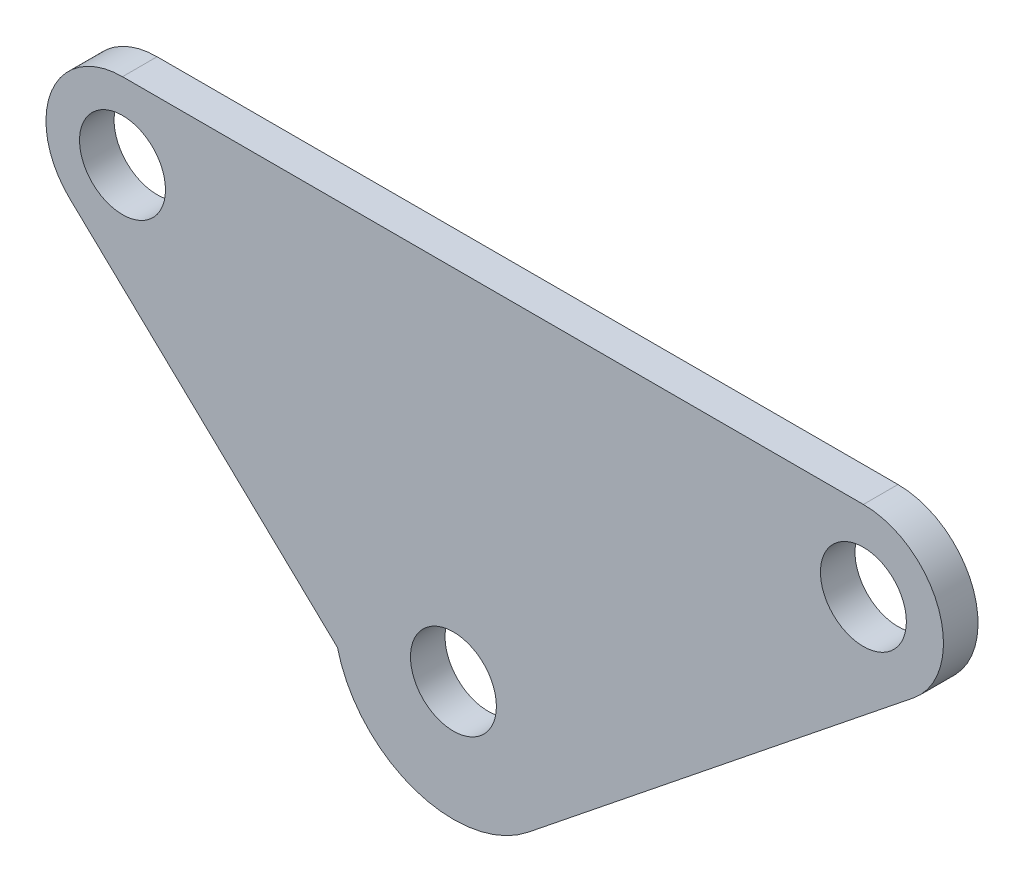
ISO-10303-21;
HEADER;
FILE_DESCRIPTION(('STEP AP214'),'2;1');
FILE_NAME('part.step','',(''),(''),'','','');
FILE_SCHEMA(('AUTOMOTIVE_DESIGN { 1 0 10303 214 1 1 1 1 }'));
ENDSEC;
DATA;
#1=APPLICATION_CONTEXT('core data for automotive mechanical design processes');
#2=APPLICATION_PROTOCOL_DEFINITION('international standard','automotive_design',2000,#1);
#3=PRODUCT_CONTEXT('',#1,'mechanical');
#4=PRODUCT('Part','Part','',(#3));
#5=PRODUCT_RELATED_PRODUCT_CATEGORY('part','',(#4));
#6=PRODUCT_DEFINITION_FORMATION('','',#4);
#7=PRODUCT_DEFINITION_CONTEXT('part definition',#1,'design');
#8=PRODUCT_DEFINITION('design','',#6,#7);
#9=PRODUCT_DEFINITION_SHAPE('','',#8);
#10=(LENGTH_UNIT() NAMED_UNIT(*) SI_UNIT(.MILLI.,.METRE.));
#11=(NAMED_UNIT(*) PLANE_ANGLE_UNIT() SI_UNIT($,.RADIAN.));
#12=(NAMED_UNIT(*) SI_UNIT($,.STERADIAN.) SOLID_ANGLE_UNIT());
#13=UNCERTAINTY_MEASURE_WITH_UNIT(LENGTH_MEASURE(1.E-05),#10,'distance_accuracy_value','');
#14=(GEOMETRIC_REPRESENTATION_CONTEXT(3) GLOBAL_UNCERTAINTY_ASSIGNED_CONTEXT((#13)) GLOBAL_UNIT_ASSIGNED_CONTEXT((#10,
#11,#12)) REPRESENTATION_CONTEXT('',''));
#15=CARTESIAN_POINT('',(0.,0.,0.));
#16=DIRECTION('',(0.,0.,1.));
#17=DIRECTION('',(1.,0.,0.));
#18=AXIS2_PLACEMENT_3D('',#15,#16,#17);
#19=CARTESIAN_POINT('',(-25.1557154604881,24.9764348991561,0.));
#20=DIRECTION('',(0.,0.,-1.));
#21=DIRECTION('',(-1.,0.,0.));
#22=AXIS2_PLACEMENT_3D('',#19,#20,#21);
#23=PLANE('',#22);
#24=CARTESIAN_POINT('',(-25.155715460488,24.9764348991561,0.));
#25=DIRECTION('',(0.,0.,1.));
#26=DIRECTION('',(1.,0.,0.));
#27=AXIS2_PLACEMENT_3D('',#24,#25,#26);
#28=CIRCLE('',#27,4.35);
#29=CARTESIAN_POINT('',(-20.805715460488,24.9764348991561,0.));
#30=VERTEX_POINT('',#29);
#31=EDGE_CURVE('E224',#30,#30,#28,.T.);
#32=ORIENTED_EDGE('',*,*,#31,.F.);
#33=EDGE_LOOP('',(#32));
#34=FACE_BOUND('',#33,.T.);
#35=CARTESIAN_POINT('',(8.34368763549736,-3.55294561262175,0.));
#36=DIRECTION('',(0.,0.,1.));
#37=DIRECTION('',(1.,0.,0.));
#38=AXIS2_PLACEMENT_3D('',#35,#36,#37);
#39=CIRCLE('',#38,4.35);
#40=CARTESIAN_POINT('',(12.6936876354974,-3.55294561262175,0.));
#41=VERTEX_POINT('',#40);
#42=EDGE_CURVE('E228',#41,#41,#39,.T.);
#43=ORIENTED_EDGE('',*,*,#42,.F.);
#44=EDGE_LOOP('',(#43));
#45=FACE_BOUND('',#44,.T.);
#46=CARTESIAN_POINT('',(49.8442845395119,24.6173180206352,0.));
#47=DIRECTION('',(0.,0.,1.));
#48=DIRECTION('',(1.,0.,0.));
#49=AXIS2_PLACEMENT_3D('',#46,#47,#48);
#50=CIRCLE('',#49,4.35);
#51=CARTESIAN_POINT('',(54.1942845395119,24.6173180206352,0.));
#52=VERTEX_POINT('',#51);
#53=EDGE_CURVE('E154',#52,#52,#50,.T.);
#54=ORIENTED_EDGE('',*,*,#53,.F.);
#55=EDGE_LOOP('',(#54));
#56=FACE_BOUND('',#55,.T.);
#57=DIRECTION('',(0.78018197470434,0.625552624761848,0.));
#58=VECTOR('',#57,1.);
#59=CARTESIAN_POINT('',(12.5611499458894,-15.6661204532109,0.));
#60=LINE('',#59,#58);
#61=CARTESIAN_POINT('',(15.9058214676602,-12.9843511772637,0.));
#62=VERTEX_POINT('',#61);
#63=CARTESIAN_POINT('',(54.9149202028772,18.2932800608287,0.));
#64=VERTEX_POINT('',#63);
#65=EDGE_CURVE('E99',#62,#64,#60,.T.);
#66=ORIENTED_EDGE('',*,*,#65,.T.);
#67=CARTESIAN_POINT('',(49.8442845395119,24.6173180206352,0.));
#68=DIRECTION('',(0.,0.,1.));
#69=DIRECTION('',(1.,0.,0.));
#70=AXIS2_PLACEMENT_3D('',#67,#68,#69);
#71=CIRCLE('',#70,8.10584987201626);
#72=CARTESIAN_POINT('',(49.8442845395119,32.7231678926515,0.));
#73=VERTEX_POINT('',#72);
#74=EDGE_CURVE('E147',#73,#64,#71,.F.);
#75=ORIENTED_EDGE('',*,*,#74,.F.);
#76=DIRECTION('',(-1.,0.,0.));
#77=VECTOR('',#76,1.);
#78=CARTESIAN_POINT('',(0.,32.7231678926515,0.));
#79=LINE('',#78,#77);
#80=CARTESIAN_POINT('',(-25.1557154604881,32.7231678926515,0.));
#81=VERTEX_POINT('',#80);
#82=EDGE_CURVE('E151',#73,#81,#79,.T.);
#83=ORIENTED_EDGE('',*,*,#82,.T.);
#84=CARTESIAN_POINT('',(-25.155715460488,24.9764348991561,0.));
#85=DIRECTION('',(0.,0.,1.));
#86=DIRECTION('',(1.,0.,0.));
#87=AXIS2_PLACEMENT_3D('',#84,#85,#86);
#88=CIRCLE('',#87,7.74673299349537);
#89=CARTESIAN_POINT('',(-30.497200323128,19.3656941695646,0.));
#90=VERTEX_POINT('',#89);
#91=EDGE_CURVE('E178',#90,#81,#88,.F.);
#92=ORIENTED_EDGE('',*,*,#91,.F.);
#93=DIRECTION('',(0.724271861996882,-0.689514517555337,0.));
#94=VECTOR('',#93,1.);
#95=CARTESIAN_POINT('',(-4.82814268268854,-5.0715217761848,0.));
#96=LINE('',#95,#94);
#97=CARTESIAN_POINT('',(-3.39661911085823,-6.43434744537243,0.));
#98=VERTEX_POINT('',#97);
#99=EDGE_CURVE('E174',#90,#98,#96,.T.);
#100=ORIENTED_EDGE('',*,*,#99,.T.);
#101=CARTESIAN_POINT('',(8.34368763549738,-3.55294561262168,0.));
#102=DIRECTION('',(0.,0.,1.));
#103=DIRECTION('',(1.,0.,0.));
#104=AXIS2_PLACEMENT_3D('',#101,#102,#103);
#105=CIRCLE('',#104,12.0887252851697);
#106=EDGE_CURVE('E170',#62,#98,#105,.F.);
#107=ORIENTED_EDGE('',*,*,#106,.F.);
#108=EDGE_LOOP('',(#66,#75,#83,#92,#100,#107));
#109=FACE_BOUND('',#108,.T.);
#110=ADVANCED_FACE('F75',(#34,#45,#56,#109),#23,.F.);
#111=CARTESIAN_POINT('',(12.5611499458894,-15.6661204532109,-3.5));
#112=DIRECTION('',(0.625552624761848,-0.78018197470434,0.));
#113=DIRECTION('',(0.78018197470434,0.625552624761848,0.));
#114=AXIS2_PLACEMENT_3D('',#111,#112,#113);
#115=PLANE('',#114);
#116=ORIENTED_EDGE('',*,*,#65,.F.);
#117=DIRECTION('',(0.,0.,1.));
#118=VECTOR('',#117,1.);
#119=CARTESIAN_POINT('',(15.9058214676602,-12.9843511772637,-3.5));
#120=LINE('',#119,#118);
#121=CARTESIAN_POINT('',(15.9058214676602,-12.9843511772637,-3.5));
#122=VERTEX_POINT('',#121);
#123=EDGE_CURVE('E78',#122,#62,#120,.T.);
#124=ORIENTED_EDGE('',*,*,#123,.F.);
#125=DIRECTION('',(0.78018197470434,0.625552624761848,0.));
#126=VECTOR('',#125,1.);
#127=CARTESIAN_POINT('',(12.5611499458894,-15.6661204532109,-3.5));
#128=LINE('',#127,#126);
#129=CARTESIAN_POINT('',(54.9149202028772,18.2932800608287,-3.5));
#130=VERTEX_POINT('',#129);
#131=EDGE_CURVE('E129',#122,#130,#128,.T.);
#132=ORIENTED_EDGE('',*,*,#131,.T.);
#133=DIRECTION('',(0.,0.,1.));
#134=VECTOR('',#133,1.);
#135=CARTESIAN_POINT('',(54.9149202028772,18.2932800608287,-3.5));
#136=LINE('',#135,#134);
#137=EDGE_CURVE('E12',#130,#64,#136,.T.);
#138=ORIENTED_EDGE('',*,*,#137,.T.);
#139=EDGE_LOOP('',(#116,#124,#132,#138));
#140=FACE_BOUND('',#139,.T.);
#141=ADVANCED_FACE('F127',(#140),#115,.T.);
#142=CARTESIAN_POINT('',(49.8442845395119,24.6173180206352,-3.5));
#143=DIRECTION('',(0.,0.,1.));
#144=DIRECTION('',(1.,0.,0.));
#145=AXIS2_PLACEMENT_3D('',#142,#143,#144);
#146=CYLINDRICAL_SURFACE('',#145,8.10584987201626);
#147=ORIENTED_EDGE('',*,*,#74,.T.);
#148=ORIENTED_EDGE('',*,*,#137,.F.);
#149=CARTESIAN_POINT('',(49.8442845395119,24.6173180206352,-3.5));
#150=DIRECTION('',(0.,0.,1.));
#151=DIRECTION('',(1.,0.,0.));
#152=AXIS2_PLACEMENT_3D('',#149,#150,#151);
#153=CIRCLE('',#152,8.10584987201626);
#154=CARTESIAN_POINT('',(49.8442845395119,32.7231678926515,-3.5));
#155=VERTEX_POINT('',#154);
#156=EDGE_CURVE('E133',#155,#130,#153,.F.);
#157=ORIENTED_EDGE('',*,*,#156,.F.);
#158=DIRECTION('',(0.,0.,1.));
#159=VECTOR('',#158,1.);
#160=CARTESIAN_POINT('',(49.8442845395119,32.7231678926515,-3.5));
#161=LINE('',#160,#159);
#162=EDGE_CURVE('E84',#155,#73,#161,.T.);
#163=ORIENTED_EDGE('',*,*,#162,.T.);
#164=EDGE_LOOP('',(#147,#148,#157,#163));
#165=FACE_BOUND('',#164,.T.);
#166=ADVANCED_FACE('F207',(#165),#146,.T.);
#167=CARTESIAN_POINT('',(0.,32.7231678926515,-3.5));
#168=DIRECTION('',(0.,1.,0.));
#169=DIRECTION('',(-1.,0.,0.));
#170=AXIS2_PLACEMENT_3D('',#167,#168,#169);
#171=PLANE('',#170);
#172=ORIENTED_EDGE('',*,*,#82,.F.);
#173=ORIENTED_EDGE('',*,*,#162,.F.);
#174=DIRECTION('',(-1.,0.,0.));
#175=VECTOR('',#174,1.);
#176=CARTESIAN_POINT('',(0.,32.7231678926515,-3.5));
#177=LINE('',#176,#175);
#178=CARTESIAN_POINT('',(-25.1557154604881,32.7231678926515,-3.5));
#179=VERTEX_POINT('',#178);
#180=EDGE_CURVE('E163',#155,#179,#177,.T.);
#181=ORIENTED_EDGE('',*,*,#180,.T.);
#182=DIRECTION('',(0.,0.,1.));
#183=VECTOR('',#182,1.);
#184=CARTESIAN_POINT('',(-25.1557154604881,32.7231678926515,-3.5));
#185=LINE('',#184,#183);
#186=EDGE_CURVE('E187',#179,#81,#185,.T.);
#187=ORIENTED_EDGE('',*,*,#186,.T.);
#188=EDGE_LOOP('',(#172,#173,#181,#187));
#189=FACE_BOUND('',#188,.T.);
#190=ADVANCED_FACE('F205',(#189),#171,.T.);
#191=CARTESIAN_POINT('',(-25.155715460488,24.9764348991561,-3.5));
#192=DIRECTION('',(0.,0.,1.));
#193=DIRECTION('',(1.,0.,0.));
#194=AXIS2_PLACEMENT_3D('',#191,#192,#193);
#195=CYLINDRICAL_SURFACE('',#194,7.74673299349537);
#196=ORIENTED_EDGE('',*,*,#91,.T.);
#197=ORIENTED_EDGE('',*,*,#186,.F.);
#198=CARTESIAN_POINT('',(-25.155715460488,24.9764348991561,-3.5));
#199=DIRECTION('',(0.,0.,1.));
#200=DIRECTION('',(1.,0.,0.));
#201=AXIS2_PLACEMENT_3D('',#198,#199,#200);
#202=CIRCLE('',#201,7.74673299349537);
#203=CARTESIAN_POINT('',(-30.497200323128,19.3656941695646,-3.5));
#204=VERTEX_POINT('',#203);
#205=EDGE_CURVE('E159',#204,#179,#202,.F.);
#206=ORIENTED_EDGE('',*,*,#205,.F.);
#207=DIRECTION('',(0.,0.,1.));
#208=VECTOR('',#207,1.);
#209=CARTESIAN_POINT('',(-30.497200323128,19.3656941695646,-3.5));
#210=LINE('',#209,#208);
#211=EDGE_CURVE('E190',#204,#90,#210,.T.);
#212=ORIENTED_EDGE('',*,*,#211,.T.);
#213=EDGE_LOOP('',(#196,#197,#206,#212));
#214=FACE_BOUND('',#213,.T.);
#215=ADVANCED_FACE('F202',(#214),#195,.T.);
#216=CARTESIAN_POINT('',(-4.82814268268854,-5.0715217761848,-3.5));
#217=DIRECTION('',(-0.689514517555337,-0.724271861996882,0.));
#218=DIRECTION('',(0.724271861996882,-0.689514517555337,0.));
#219=AXIS2_PLACEMENT_3D('',#216,#217,#218);
#220=PLANE('',#219);
#221=ORIENTED_EDGE('',*,*,#99,.F.);
#222=ORIENTED_EDGE('',*,*,#211,.F.);
#223=DIRECTION('',(0.724271861996882,-0.689514517555337,0.));
#224=VECTOR('',#223,1.);
#225=CARTESIAN_POINT('',(-4.82814268268854,-5.0715217761848,-3.5));
#226=LINE('',#225,#224);
#227=CARTESIAN_POINT('',(-3.39661911085823,-6.43434744537243,-3.5));
#228=VERTEX_POINT('',#227);
#229=EDGE_CURVE('E140',#204,#228,#226,.T.);
#230=ORIENTED_EDGE('',*,*,#229,.T.);
#231=DIRECTION('',(0.,0.,1.));
#232=VECTOR('',#231,1.);
#233=CARTESIAN_POINT('',(-3.39661911085823,-6.43434744537243,-3.5));
#234=LINE('',#233,#232);
#235=EDGE_CURVE('E92',#228,#98,#234,.T.);
#236=ORIENTED_EDGE('',*,*,#235,.T.);
#237=EDGE_LOOP('',(#221,#222,#230,#236));
#238=FACE_BOUND('',#237,.T.);
#239=ADVANCED_FACE('F195',(#238),#220,.T.);
#240=CARTESIAN_POINT('',(8.34368763549738,-3.55294561262168,-3.5));
#241=DIRECTION('',(0.,0.,1.));
#242=DIRECTION('',(1.,0.,0.));
#243=AXIS2_PLACEMENT_3D('',#240,#241,#242);
#244=CYLINDRICAL_SURFACE('',#243,12.0887252851697);
#245=ORIENTED_EDGE('',*,*,#106,.T.);
#246=ORIENTED_EDGE('',*,*,#235,.F.);
#247=CARTESIAN_POINT('',(8.34368763549738,-3.55294561262168,-3.5));
#248=DIRECTION('',(0.,0.,1.));
#249=DIRECTION('',(1.,0.,0.));
#250=AXIS2_PLACEMENT_3D('',#247,#248,#249);
#251=CIRCLE('',#250,12.0887252851697);
#252=EDGE_CURVE('E135',#122,#228,#251,.F.);
#253=ORIENTED_EDGE('',*,*,#252,.F.);
#254=ORIENTED_EDGE('',*,*,#123,.T.);
#255=EDGE_LOOP('',(#245,#246,#253,#254));
#256=FACE_BOUND('',#255,.T.);
#257=ADVANCED_FACE('F136',(#256),#244,.T.);
#258=CARTESIAN_POINT('',(-25.1557154604881,24.9764348991561,-3.5));
#259=DIRECTION('',(0.,0.,-1.));
#260=DIRECTION('',(-1.,0.,0.));
#261=AXIS2_PLACEMENT_3D('',#258,#259,#260);
#262=PLANE('',#261);
#263=CARTESIAN_POINT('',(-25.155715460488,24.9764348991561,-3.5));
#264=DIRECTION('',(0.,0.,1.));
#265=DIRECTION('',(1.,0.,0.));
#266=AXIS2_PLACEMENT_3D('',#263,#264,#265);
#267=CIRCLE('',#266,4.35);
#268=CARTESIAN_POINT('',(-20.805715460488,24.9764348991561,-3.5));
#269=VERTEX_POINT('',#268);
#270=EDGE_CURVE('E171',#269,#269,#267,.T.);
#271=ORIENTED_EDGE('',*,*,#270,.T.);
#272=EDGE_LOOP('',(#271));
#273=FACE_BOUND('',#272,.T.);
#274=CARTESIAN_POINT('',(8.34368763549736,-3.55294561262175,-3.5));
#275=DIRECTION('',(0.,0.,1.));
#276=DIRECTION('',(1.,0.,0.));
#277=AXIS2_PLACEMENT_3D('',#274,#275,#276);
#278=CIRCLE('',#277,4.35);
#279=CARTESIAN_POINT('',(12.6936876354974,-3.55294561262175,-3.5));
#280=VERTEX_POINT('',#279);
#281=EDGE_CURVE('E239',#280,#280,#278,.T.);
#282=ORIENTED_EDGE('',*,*,#281,.T.);
#283=EDGE_LOOP('',(#282));
#284=FACE_BOUND('',#283,.T.);
#285=CARTESIAN_POINT('',(49.8442845395119,24.6173180206352,-3.5));
#286=DIRECTION('',(0.,0.,1.));
#287=DIRECTION('',(1.,0.,0.));
#288=AXIS2_PLACEMENT_3D('',#285,#286,#287);
#289=CIRCLE('',#288,4.35);
#290=CARTESIAN_POINT('',(54.1942845395119,24.6173180206352,-3.5));
#291=VERTEX_POINT('',#290);
#292=EDGE_CURVE('E233',#291,#291,#289,.T.);
#293=ORIENTED_EDGE('',*,*,#292,.T.);
#294=EDGE_LOOP('',(#293));
#295=FACE_BOUND('',#294,.T.);
#296=ORIENTED_EDGE('',*,*,#156,.T.);
#297=ORIENTED_EDGE('',*,*,#131,.F.);
#298=ORIENTED_EDGE('',*,*,#252,.T.);
#299=ORIENTED_EDGE('',*,*,#229,.F.);
#300=ORIENTED_EDGE('',*,*,#205,.T.);
#301=ORIENTED_EDGE('',*,*,#180,.F.);
#302=EDGE_LOOP('',(#296,#297,#298,#299,#300,#301));
#303=FACE_BOUND('',#302,.T.);
#304=ADVANCED_FACE('F143',(#273,#284,#295,#303),#262,.T.);
#305=CARTESIAN_POINT('',(49.8442845395119,24.6173180206352,-3.5));
#306=DIRECTION('',(0.,0.,1.));
#307=DIRECTION('',(1.,0.,0.));
#308=AXIS2_PLACEMENT_3D('',#305,#306,#307);
#309=CYLINDRICAL_SURFACE('',#308,4.35);
#310=ORIENTED_EDGE('',*,*,#292,.F.);
#311=EDGE_LOOP('',(#310));
#312=FACE_BOUND('',#311,.T.);
#313=ORIENTED_EDGE('',*,*,#53,.T.);
#314=EDGE_LOOP('',(#313));
#315=FACE_BOUND('',#314,.T.);
#316=ADVANCED_FACE('F261',(#312,#315),#309,.F.);
#317=CARTESIAN_POINT('',(8.34368763549736,-3.55294561262175,-3.5));
#318=DIRECTION('',(0.,0.,1.));
#319=DIRECTION('',(1.,0.,0.));
#320=AXIS2_PLACEMENT_3D('',#317,#318,#319);
#321=CYLINDRICAL_SURFACE('',#320,4.35);
#322=ORIENTED_EDGE('',*,*,#281,.F.);
#323=EDGE_LOOP('',(#322));
#324=FACE_BOUND('',#323,.T.);
#325=ORIENTED_EDGE('',*,*,#42,.T.);
#326=EDGE_LOOP('',(#325));
#327=FACE_BOUND('',#326,.T.);
#328=ADVANCED_FACE('F256',(#324,#327),#321,.F.);
#329=CARTESIAN_POINT('',(-25.155715460488,24.9764348991561,-3.5));
#330=DIRECTION('',(0.,0.,1.));
#331=DIRECTION('',(1.,0.,0.));
#332=AXIS2_PLACEMENT_3D('',#329,#330,#331);
#333=CYLINDRICAL_SURFACE('',#332,4.35);
#334=ORIENTED_EDGE('',*,*,#270,.F.);
#335=EDGE_LOOP('',(#334));
#336=FACE_BOUND('',#335,.T.);
#337=ORIENTED_EDGE('',*,*,#31,.T.);
#338=EDGE_LOOP('',(#337));
#339=FACE_BOUND('',#338,.T.);
#340=ADVANCED_FACE('F253',(#336,#339),#333,.F.);
#341=CLOSED_SHELL('',(#110,#141,#166,#190,#215,#239,#257,#304,#316,#328,#340));
#342=MANIFOLD_SOLID_BREP('B2',#341);
#343=ADVANCED_BREP_SHAPE_REPRESENTATION('',(#18,#342),#14);
#344=SHAPE_DEFINITION_REPRESENTATION(#9,#343);
ENDSEC;
END-ISO-10303-21;
